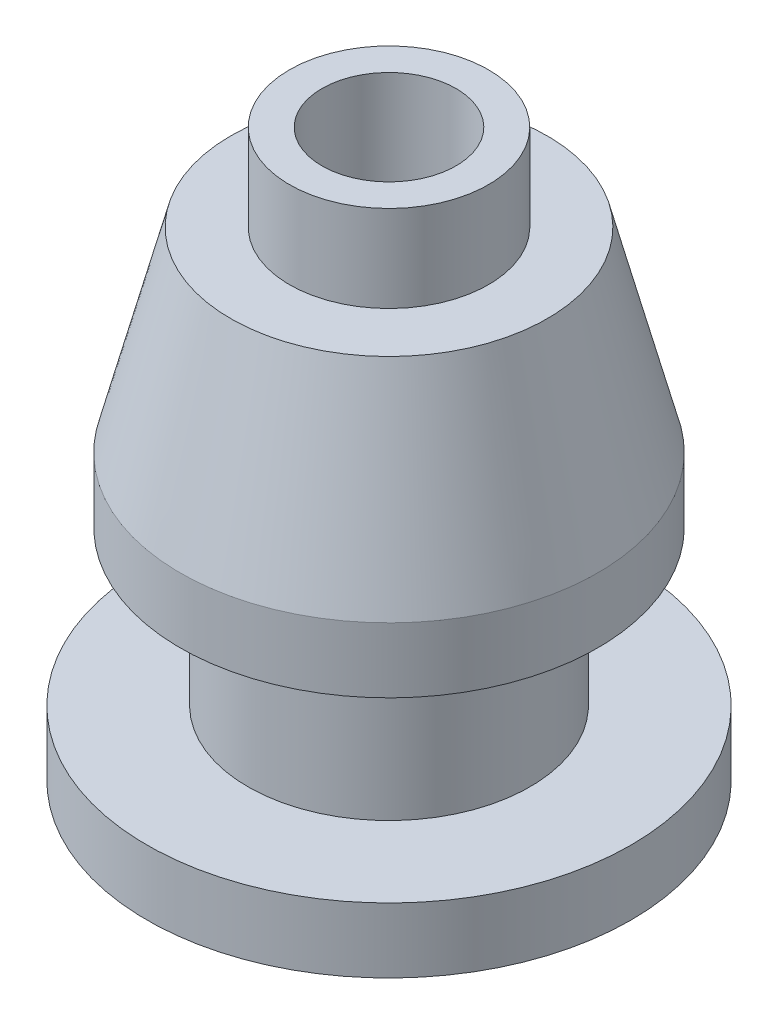
ISO-10303-21;
HEADER;
FILE_DESCRIPTION(('STEP AP214'),'2;1');
FILE_NAME('part.step','',(''),(''),'','','');
FILE_SCHEMA(('AUTOMOTIVE_DESIGN { 1 0 10303 214 1 1 1 1 }'));
ENDSEC;
DATA;
#1=APPLICATION_CONTEXT('core data for automotive mechanical design processes');
#2=APPLICATION_PROTOCOL_DEFINITION('international standard','automotive_design',2000,#1);
#3=PRODUCT_CONTEXT('',#1,'mechanical');
#4=PRODUCT('Part','Part','',(#3));
#5=PRODUCT_RELATED_PRODUCT_CATEGORY('part','',(#4));
#6=PRODUCT_DEFINITION_FORMATION('','',#4);
#7=PRODUCT_DEFINITION_CONTEXT('part definition',#1,'design');
#8=PRODUCT_DEFINITION('design','',#6,#7);
#9=PRODUCT_DEFINITION_SHAPE('','',#8);
#10=(LENGTH_UNIT() NAMED_UNIT(*) SI_UNIT(.MILLI.,.METRE.));
#11=(NAMED_UNIT(*) PLANE_ANGLE_UNIT() SI_UNIT($,.RADIAN.));
#12=(NAMED_UNIT(*) SI_UNIT($,.STERADIAN.) SOLID_ANGLE_UNIT());
#13=UNCERTAINTY_MEASURE_WITH_UNIT(LENGTH_MEASURE(1.E-05),#10,'distance_accuracy_value','');
#14=(GEOMETRIC_REPRESENTATION_CONTEXT(3) GLOBAL_UNCERTAINTY_ASSIGNED_CONTEXT((#13)) GLOBAL_UNIT_ASSIGNED_CONTEXT((#10,
#11,#12)) REPRESENTATION_CONTEXT('',''));
#15=CARTESIAN_POINT('',(0.,0.,0.));
#16=DIRECTION('',(0.,0.,1.));
#17=DIRECTION('',(1.,0.,0.));
#18=AXIS2_PLACEMENT_3D('',#15,#16,#17);
#19=CARTESIAN_POINT('',(45.9574468085107,237.530722144744,0.));
#20=DIRECTION('',(0.,-1.,0.));
#21=DIRECTION('',(1.,0.,0.));
#22=AXIS2_PLACEMENT_3D('',#19,#20,#21);
#23=PLANE('',#22);
#24=CARTESIAN_POINT('',(0.,237.530722144744,0.));
#25=DIRECTION('',(0.,1.,0.));
#26=DIRECTION('',(-1.,0.,0.));
#27=AXIS2_PLACEMENT_3D('',#24,#25,#26);
#28=CIRCLE('',#27,30.9574468085107);
#29=CARTESIAN_POINT('',(-30.9574468085108,237.530722144744,0.));
#30=VERTEX_POINT('',#29);
#31=EDGE_CURVE('E10',#30,#30,#28,.T.);
#32=ORIENTED_EDGE('',*,*,#31,.F.);
#33=EDGE_LOOP('',(#32));
#34=FACE_BOUND('',#33,.T.);
#35=CARTESIAN_POINT('',(0.,237.530722144744,0.));
#36=DIRECTION('',(0.,1.,0.));
#37=DIRECTION('',(-1.,0.,0.));
#38=AXIS2_PLACEMENT_3D('',#35,#36,#37);
#39=CIRCLE('',#38,45.9574468085107);
#40=CARTESIAN_POINT('',(-45.9574468085108,237.530722144744,0.));
#41=VERTEX_POINT('',#40);
#42=EDGE_CURVE('E87',#41,#41,#39,.T.);
#43=ORIENTED_EDGE('',*,*,#42,.T.);
#44=EDGE_LOOP('',(#43));
#45=FACE_BOUND('',#44,.T.);
#46=ADVANCED_FACE('F40',(#34,#45),#23,.F.);
#47=CARTESIAN_POINT('',(0.,2.5531914893617,0.));
#48=DIRECTION('',(0.,1.,0.));
#49=DIRECTION('',(-1.,0.,0.));
#50=AXIS2_PLACEMENT_3D('',#47,#48,#49);
#51=CYLINDRICAL_SURFACE('',#50,30.9574468085107);
#52=CARTESIAN_POINT('',(0.,-23.6394906212139,0.));
#53=DIRECTION('',(0.,1.,0.));
#54=DIRECTION('',(-1.,0.,0.));
#55=AXIS2_PLACEMENT_3D('',#52,#53,#54);
#56=CIRCLE('',#55,30.9574468085107);
#57=CARTESIAN_POINT('',(-30.9574468085107,-23.6394906212139,0.));
#58=VERTEX_POINT('',#57);
#59=EDGE_CURVE('E47',#58,#58,#56,.T.);
#60=ORIENTED_EDGE('',*,*,#59,.F.);
#61=EDGE_LOOP('',(#60));
#62=FACE_BOUND('',#61,.T.);
#63=ORIENTED_EDGE('',*,*,#31,.T.);
#64=EDGE_LOOP('',(#63));
#65=FACE_BOUND('',#64,.T.);
#66=ADVANCED_FACE('F143',(#62,#65),#51,.F.);
#67=CARTESIAN_POINT('',(30.9574468085107,-23.6394906212139,0.));
#68=DIRECTION('',(0.,1.,0.));
#69=DIRECTION('',(-1.,0.,0.));
#70=AXIS2_PLACEMENT_3D('',#67,#68,#69);
#71=PLANE('',#70);
#72=CARTESIAN_POINT('',(0.,-23.6394906212139,0.));
#73=DIRECTION('',(0.,1.,0.));
#74=DIRECTION('',(-1.,0.,0.));
#75=AXIS2_PLACEMENT_3D('',#72,#73,#74);
#76=CIRCLE('',#75,111.702127659544);
#77=CARTESIAN_POINT('',(-111.702127659544,-23.6394906212139,0.));
#78=VERTEX_POINT('',#77);
#79=EDGE_CURVE('E52',#78,#78,#76,.T.);
#80=ORIENTED_EDGE('',*,*,#79,.F.);
#81=EDGE_LOOP('',(#80));
#82=FACE_BOUND('',#81,.T.);
#83=ORIENTED_EDGE('',*,*,#59,.T.);
#84=EDGE_LOOP('',(#83));
#85=FACE_BOUND('',#84,.T.);
#86=ADVANCED_FACE('F138',(#82,#85),#71,.F.);
#87=CARTESIAN_POINT('',(0.,2.5531914893617,0.));
#88=DIRECTION('',(0.,1.,0.));
#89=DIRECTION('',(-1.,0.,0.));
#90=AXIS2_PLACEMENT_3D('',#87,#88,#89);
#91=CYLINDRICAL_SURFACE('',#90,111.702127659544);
#92=CARTESIAN_POINT('',(0.,6.36050937878612,0.));
#93=DIRECTION('',(0.,1.,0.));
#94=DIRECTION('',(-1.,0.,0.));
#95=AXIS2_PLACEMENT_3D('',#92,#93,#94);
#96=CIRCLE('',#95,111.702127659544);
#97=CARTESIAN_POINT('',(-111.702127659544,6.3605093787861,0.));
#98=VERTEX_POINT('',#97);
#99=EDGE_CURVE('E57',#98,#98,#96,.T.);
#100=ORIENTED_EDGE('',*,*,#99,.F.);
#101=EDGE_LOOP('',(#100));
#102=FACE_BOUND('',#101,.T.);
#103=ORIENTED_EDGE('',*,*,#79,.T.);
#104=EDGE_LOOP('',(#103));
#105=FACE_BOUND('',#104,.T.);
#106=ADVANCED_FACE('F132',(#102,#105),#91,.T.);
#107=CARTESIAN_POINT('',(111.702127659544,6.36050937878613,0.));
#108=DIRECTION('',(0.,-1.,0.));
#109=DIRECTION('',(1.,0.,0.));
#110=AXIS2_PLACEMENT_3D('',#107,#108,#109);
#111=PLANE('',#110);
#112=CARTESIAN_POINT('',(0.,6.36050937878612,0.));
#113=DIRECTION('',(0.,1.,0.));
#114=DIRECTION('',(-1.,0.,0.));
#115=AXIS2_PLACEMENT_3D('',#112,#113,#114);
#116=CIRCLE('',#115,65.1063829787235);
#117=CARTESIAN_POINT('',(-65.1063829787235,6.36050937878611,0.));
#118=VERTEX_POINT('',#117);
#119=EDGE_CURVE('E63',#118,#118,#116,.T.);
#120=ORIENTED_EDGE('',*,*,#119,.F.);
#121=EDGE_LOOP('',(#120));
#122=FACE_BOUND('',#121,.T.);
#123=ORIENTED_EDGE('',*,*,#99,.T.);
#124=EDGE_LOOP('',(#123));
#125=FACE_BOUND('',#124,.T.);
#126=ADVANCED_FACE('F126',(#122,#125),#111,.F.);
#127=CARTESIAN_POINT('',(0.,2.5531914893617,0.));
#128=DIRECTION('',(0.,1.,0.));
#129=DIRECTION('',(-1.,0.,0.));
#130=AXIS2_PLACEMENT_3D('',#127,#128,#129);
#131=CYLINDRICAL_SURFACE('',#130,65.1063829787235);
#132=CARTESIAN_POINT('',(0.,77.5307221447436,0.));
#133=DIRECTION('',(0.,1.,0.));
#134=DIRECTION('',(-1.,0.,0.));
#135=AXIS2_PLACEMENT_3D('',#132,#133,#134);
#136=CIRCLE('',#135,65.1063829787235);
#137=CARTESIAN_POINT('',(-65.1063829787235,77.5307221447436,0.));
#138=VERTEX_POINT('',#137);
#139=EDGE_CURVE('E67',#138,#138,#136,.T.);
#140=ORIENTED_EDGE('',*,*,#139,.F.);
#141=EDGE_LOOP('',(#140));
#142=FACE_BOUND('',#141,.T.);
#143=ORIENTED_EDGE('',*,*,#119,.T.);
#144=EDGE_LOOP('',(#143));
#145=FACE_BOUND('',#144,.T.);
#146=ADVANCED_FACE('F120',(#142,#145),#131,.T.);
#147=CARTESIAN_POINT('',(65.1063829787235,77.5307221447436,0.));
#148=DIRECTION('',(0.,1.,0.));
#149=DIRECTION('',(-1.,0.,0.));
#150=AXIS2_PLACEMENT_3D('',#147,#148,#149);
#151=PLANE('',#150);
#152=CARTESIAN_POINT('',(0.,77.5307221447436,0.));
#153=DIRECTION('',(0.,1.,0.));
#154=DIRECTION('',(-1.,0.,0.));
#155=AXIS2_PLACEMENT_3D('',#152,#153,#154);
#156=CIRCLE('',#155,96.3829787234043);
#157=CARTESIAN_POINT('',(-96.3829787234043,77.5307221447436,0.));
#158=VERTEX_POINT('',#157);
#159=EDGE_CURVE('E71',#158,#158,#156,.T.);
#160=ORIENTED_EDGE('',*,*,#159,.F.);
#161=EDGE_LOOP('',(#160));
#162=FACE_BOUND('',#161,.T.);
#163=ORIENTED_EDGE('',*,*,#139,.T.);
#164=EDGE_LOOP('',(#163));
#165=FACE_BOUND('',#164,.T.);
#166=ADVANCED_FACE('F114',(#162,#165),#151,.F.);
#167=CARTESIAN_POINT('',(0.,2.5531914893617,0.));
#168=DIRECTION('',(0.,1.,0.));
#169=DIRECTION('',(-1.,0.,0.));
#170=AXIS2_PLACEMENT_3D('',#167,#168,#169);
#171=CYLINDRICAL_SURFACE('',#170,96.3829787234043);
#172=CARTESIAN_POINT('',(0.,107.530722144744,0.));
#173=DIRECTION('',(0.,1.,0.));
#174=DIRECTION('',(-1.,0.,0.));
#175=AXIS2_PLACEMENT_3D('',#172,#173,#174);
#176=CIRCLE('',#175,96.3829787234043);
#177=CARTESIAN_POINT('',(-96.3829787234043,107.530722144744,0.));
#178=VERTEX_POINT('',#177);
#179=EDGE_CURVE('E75',#178,#178,#176,.T.);
#180=ORIENTED_EDGE('',*,*,#179,.F.);
#181=EDGE_LOOP('',(#180));
#182=FACE_BOUND('',#181,.T.);
#183=ORIENTED_EDGE('',*,*,#159,.T.);
#184=EDGE_LOOP('',(#183));
#185=FACE_BOUND('',#184,.T.);
#186=ADVANCED_FACE('F108',(#182,#185),#171,.T.);
#187=CARTESIAN_POINT('',(0.,107.530722144744,0.));
#188=DIRECTION('',(0.,-1.,0.));
#189=DIRECTION('',(1.,0.,0.));
#190=AXIS2_PLACEMENT_3D('',#187,#188,#189);
#191=CONICAL_SURFACE('',#190,96.3829787234043,0.253304865386284);
#192=CARTESIAN_POINT('',(0.,197.530722144744,0.));
#193=DIRECTION('',(0.,1.,0.));
#194=DIRECTION('',(-1.,0.,0.));
#195=AXIS2_PLACEMENT_3D('',#192,#193,#194);
#196=CIRCLE('',#195,73.0851063829698);
#197=CARTESIAN_POINT('',(-73.0851063829699,197.530722144744,0.));
#198=VERTEX_POINT('',#197);
#199=EDGE_CURVE('E79',#198,#198,#196,.T.);
#200=ORIENTED_EDGE('',*,*,#199,.F.);
#201=EDGE_LOOP('',(#200));
#202=FACE_BOUND('',#201,.T.);
#203=ORIENTED_EDGE('',*,*,#179,.T.);
#204=EDGE_LOOP('',(#203));
#205=FACE_BOUND('',#204,.T.);
#206=ADVANCED_FACE('F102',(#202,#205),#191,.T.);
#207=CARTESIAN_POINT('',(73.0851063829698,197.530722144744,0.));
#208=DIRECTION('',(0.,-1.,0.));
#209=DIRECTION('',(1.,0.,0.));
#210=AXIS2_PLACEMENT_3D('',#207,#208,#209);
#211=PLANE('',#210);
#212=CARTESIAN_POINT('',(0.,197.530722144744,0.));
#213=DIRECTION('',(0.,1.,0.));
#214=DIRECTION('',(-1.,0.,0.));
#215=AXIS2_PLACEMENT_3D('',#212,#213,#214);
#216=CIRCLE('',#215,45.9574468085107);
#217=CARTESIAN_POINT('',(-45.9574468085107,197.530722144744,0.));
#218=VERTEX_POINT('',#217);
#219=EDGE_CURVE('E83',#218,#218,#216,.T.);
#220=ORIENTED_EDGE('',*,*,#219,.F.);
#221=EDGE_LOOP('',(#220));
#222=FACE_BOUND('',#221,.T.);
#223=ORIENTED_EDGE('',*,*,#199,.T.);
#224=EDGE_LOOP('',(#223));
#225=FACE_BOUND('',#224,.T.);
#226=ADVANCED_FACE('F96',(#222,#225),#211,.F.);
#227=CARTESIAN_POINT('',(0.,2.5531914893617,0.));
#228=DIRECTION('',(0.,1.,0.));
#229=DIRECTION('',(-1.,0.,0.));
#230=AXIS2_PLACEMENT_3D('',#227,#228,#229);
#231=CYLINDRICAL_SURFACE('',#230,45.9574468085107);
#232=ORIENTED_EDGE('',*,*,#42,.F.);
#233=EDGE_LOOP('',(#232));
#234=FACE_BOUND('',#233,.T.);
#235=ORIENTED_EDGE('',*,*,#219,.T.);
#236=EDGE_LOOP('',(#235));
#237=FACE_BOUND('',#236,.T.);
#238=ADVANCED_FACE('F93',(#234,#237),#231,.T.);
#239=CLOSED_SHELL('',(#46,#66,#86,#106,#126,#146,#166,#186,#206,#226,#238));
#240=MANIFOLD_SOLID_BREP('B2',#239);
#241=ADVANCED_BREP_SHAPE_REPRESENTATION('',(#18,#240),#14);
#242=SHAPE_DEFINITION_REPRESENTATION(#9,#241);
ENDSEC;
END-ISO-10303-21;
